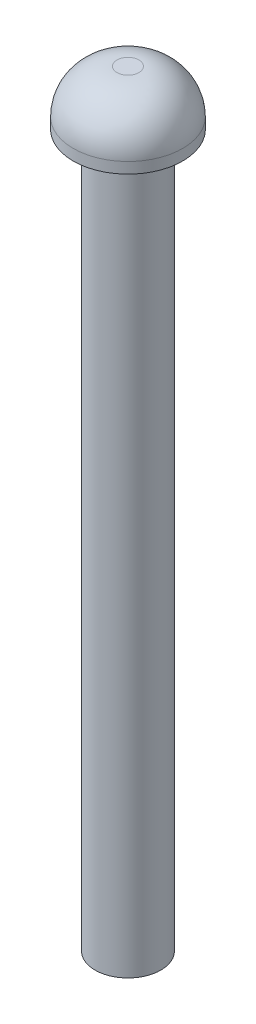
ISO-10303-21;
HEADER;
FILE_DESCRIPTION(('STEP AP214'),'2;1');
FILE_NAME('part.step','',(''),(''),'','','');
FILE_SCHEMA(('AUTOMOTIVE_DESIGN { 1 0 10303 214 1 1 1 1 }'));
ENDSEC;
DATA;
#1=APPLICATION_CONTEXT('core data for automotive mechanical design processes');
#2=APPLICATION_PROTOCOL_DEFINITION('international standard','automotive_design',2000,#1);
#3=PRODUCT_CONTEXT('',#1,'mechanical');
#4=PRODUCT('Part','Part','',(#3));
#5=PRODUCT_RELATED_PRODUCT_CATEGORY('part','',(#4));
#6=PRODUCT_DEFINITION_FORMATION('','',#4);
#7=PRODUCT_DEFINITION_CONTEXT('part definition',#1,'design');
#8=PRODUCT_DEFINITION('design','',#6,#7);
#9=PRODUCT_DEFINITION_SHAPE('','',#8);
#10=(LENGTH_UNIT() NAMED_UNIT(*) SI_UNIT(.MILLI.,.METRE.));
#11=(NAMED_UNIT(*) PLANE_ANGLE_UNIT() SI_UNIT($,.RADIAN.));
#12=(NAMED_UNIT(*) SI_UNIT($,.STERADIAN.) SOLID_ANGLE_UNIT());
#13=UNCERTAINTY_MEASURE_WITH_UNIT(LENGTH_MEASURE(1.E-05),#10,'distance_accuracy_value','');
#14=(GEOMETRIC_REPRESENTATION_CONTEXT(3) GLOBAL_UNCERTAINTY_ASSIGNED_CONTEXT((#13)) GLOBAL_UNIT_ASSIGNED_CONTEXT((#10,
#11,#12)) REPRESENTATION_CONTEXT('',''));
#15=CARTESIAN_POINT('',(0.,0.,0.));
#16=DIRECTION('',(0.,0.,1.));
#17=DIRECTION('',(1.,0.,0.));
#18=AXIS2_PLACEMENT_3D('',#15,#16,#17);
#19=CARTESIAN_POINT('',(0.,65.,0.));
#20=DIRECTION('',(0.,-1.,0.));
#21=DIRECTION('',(0.,0.,-1.));
#22=AXIS2_PLACEMENT_3D('',#19,#20,#21);
#23=CYLINDRICAL_SURFACE('',#22,3.);
#24=CARTESIAN_POINT('',(0.,65.,0.));
#25=DIRECTION('',(0.,1.,0.));
#26=DIRECTION('',(0.,0.,1.));
#27=AXIS2_PLACEMENT_3D('',#24,#25,#26);
#28=CIRCLE('',#27,3.);
#29=CARTESIAN_POINT('',(0.,65.,3.));
#30=VERTEX_POINT('',#29);
#31=EDGE_CURVE('E43',#30,#30,#28,.T.);
#32=ORIENTED_EDGE('',*,*,#31,.F.);
#33=EDGE_LOOP('',(#32));
#34=FACE_BOUND('',#33,.T.);
#35=CARTESIAN_POINT('',(0.,0.,0.));
#36=DIRECTION('',(0.,1.,0.));
#37=DIRECTION('',(0.,0.,1.));
#38=AXIS2_PLACEMENT_3D('',#35,#36,#37);
#39=CIRCLE('',#38,3.);
#40=CARTESIAN_POINT('',(0.,0.,3.));
#41=VERTEX_POINT('',#40);
#42=EDGE_CURVE('E47',#41,#41,#39,.T.);
#43=ORIENTED_EDGE('',*,*,#42,.T.);
#44=EDGE_LOOP('',(#43));
#45=FACE_BOUND('',#44,.T.);
#46=ADVANCED_FACE('F32',(#34,#45),#23,.T.);
#47=CARTESIAN_POINT('',(0.,0.,0.));
#48=DIRECTION('',(0.,1.,0.));
#49=DIRECTION('',(0.,0.,1.));
#50=AXIS2_PLACEMENT_3D('',#47,#48,#49);
#51=PLANE('',#50);
#52=ORIENTED_EDGE('',*,*,#42,.F.);
#53=EDGE_LOOP('',(#52));
#54=FACE_BOUND('',#53,.T.);
#55=ADVANCED_FACE('F71',(#54),#51,.F.);
#56=CARTESIAN_POINT('',(0.,70.,0.));
#57=DIRECTION('',(0.,-1.,0.));
#58=DIRECTION('',(0.,0.,-1.));
#59=AXIS2_PLACEMENT_3D('',#56,#57,#58);
#60=CYLINDRICAL_SURFACE('',#59,5.);
#61=CARTESIAN_POINT('',(0.,66.,0.));
#62=DIRECTION('',(0.,1.,0.));
#63=DIRECTION('',(0.,0.,1.));
#64=AXIS2_PLACEMENT_3D('',#61,#62,#63);
#65=CIRCLE('',#64,5.);
#66=CARTESIAN_POINT('',(0.,66.,5.));
#67=VERTEX_POINT('',#66);
#68=EDGE_CURVE('E10',#67,#67,#65,.F.);
#69=ORIENTED_EDGE('',*,*,#68,.T.);
#70=EDGE_LOOP('',(#69));
#71=FACE_BOUND('',#70,.T.);
#72=CARTESIAN_POINT('',(0.,65.,0.));
#73=DIRECTION('',(0.,1.,0.));
#74=DIRECTION('',(0.,0.,1.));
#75=AXIS2_PLACEMENT_3D('',#72,#73,#74);
#76=CIRCLE('',#75,5.);
#77=CARTESIAN_POINT('',(0.,65.,5.));
#78=VERTEX_POINT('',#77);
#79=EDGE_CURVE('E51',#78,#78,#76,.T.);
#80=ORIENTED_EDGE('',*,*,#79,.T.);
#81=EDGE_LOOP('',(#80));
#82=FACE_BOUND('',#81,.T.);
#83=ADVANCED_FACE('F56',(#71,#82),#60,.T.);
#84=CARTESIAN_POINT('',(0.,70.,0.));
#85=DIRECTION('',(0.,1.,0.));
#86=DIRECTION('',(0.,0.,1.));
#87=AXIS2_PLACEMENT_3D('',#84,#85,#86);
#88=PLANE('',#87);
#89=CARTESIAN_POINT('',(0.,70.,0.));
#90=DIRECTION('',(0.,1.,0.));
#91=DIRECTION('',(0.,0.,1.));
#92=AXIS2_PLACEMENT_3D('',#89,#90,#91);
#93=CIRCLE('',#92,1.);
#94=CARTESIAN_POINT('',(0.,70.,1.));
#95=VERTEX_POINT('',#94);
#96=EDGE_CURVE('E39',#95,#95,#93,.T.);
#97=ORIENTED_EDGE('',*,*,#96,.T.);
#98=EDGE_LOOP('',(#97));
#99=FACE_BOUND('',#98,.T.);
#100=ADVANCED_FACE('F60',(#99),#88,.T.);
#101=CARTESIAN_POINT('',(0.,65.,0.));
#102=DIRECTION('',(0.,1.,0.));
#103=DIRECTION('',(0.,0.,1.));
#104=AXIS2_PLACEMENT_3D('',#101,#102,#103);
#105=PLANE('',#104);
#106=ORIENTED_EDGE('',*,*,#31,.T.);
#107=EDGE_LOOP('',(#106));
#108=FACE_BOUND('',#107,.T.);
#109=ORIENTED_EDGE('',*,*,#79,.F.);
#110=EDGE_LOOP('',(#109));
#111=FACE_BOUND('',#110,.T.);
#112=ADVANCED_FACE('F58',(#108,#111),#105,.F.);
#113=CARTESIAN_POINT('',(0.,66.,0.));
#114=DIRECTION('',(0.,1.,0.));
#115=DIRECTION('',(0.,0.,1.));
#116=AXIS2_PLACEMENT_3D('',#113,#114,#115);
#117=DEGENERATE_TOROIDAL_SURFACE('',#116,1.,4.,.T.);
#118=ORIENTED_EDGE('',*,*,#68,.F.);
#119=EDGE_LOOP('',(#118));
#120=FACE_BOUND('',#119,.T.);
#121=ORIENTED_EDGE('',*,*,#96,.F.);
#122=EDGE_LOOP('',(#121));
#123=FACE_BOUND('',#122,.T.);
#124=ADVANCED_FACE('F34',(#120,#123),#117,.T.);
#125=CLOSED_SHELL('',(#46,#55,#83,#100,#112,#124));
#126=MANIFOLD_SOLID_BREP('B2',#125);
#127=ADVANCED_BREP_SHAPE_REPRESENTATION('',(#18,#126),#14);
#128=SHAPE_DEFINITION_REPRESENTATION(#9,#127);
ENDSEC;
END-ISO-10303-21;
